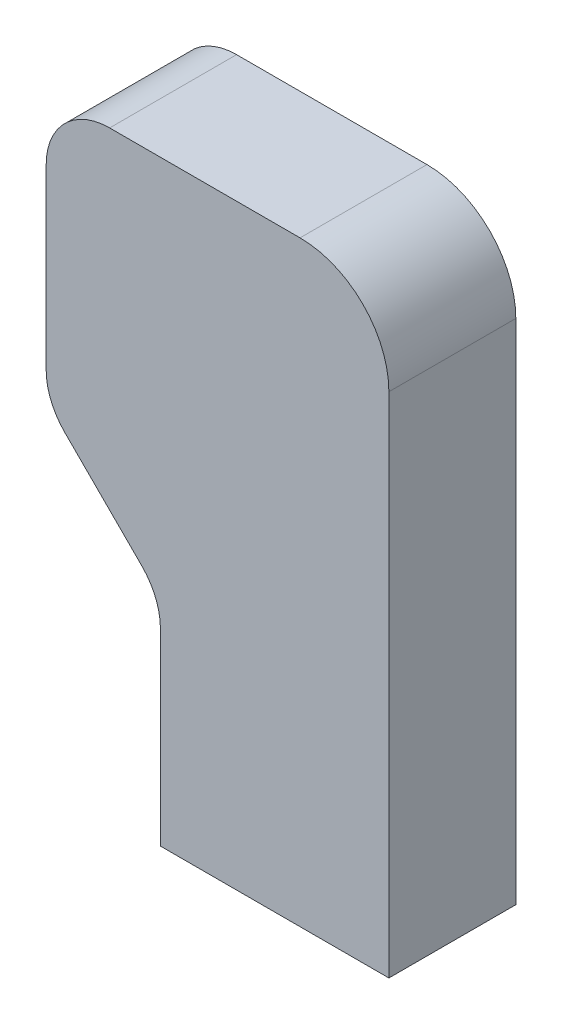
ISO-10303-21;
HEADER;
FILE_DESCRIPTION(('STEP AP214'),'2;1');
FILE_NAME('part.step','',(''),(''),'','','');
FILE_SCHEMA(('AUTOMOTIVE_DESIGN { 1 0 10303 214 1 1 1 1 }'));
ENDSEC;
DATA;
#1=APPLICATION_CONTEXT('core data for automotive mechanical design processes');
#2=APPLICATION_PROTOCOL_DEFINITION('international standard','automotive_design',2000,#1);
#3=PRODUCT_CONTEXT('',#1,'mechanical');
#4=PRODUCT('Part','Part','',(#3));
#5=PRODUCT_RELATED_PRODUCT_CATEGORY('part','',(#4));
#6=PRODUCT_DEFINITION_FORMATION('','',#4);
#7=PRODUCT_DEFINITION_CONTEXT('part definition',#1,'design');
#8=PRODUCT_DEFINITION('design','',#6,#7);
#9=PRODUCT_DEFINITION_SHAPE('','',#8);
#10=(LENGTH_UNIT() NAMED_UNIT(*) SI_UNIT(.MILLI.,.METRE.));
#11=(NAMED_UNIT(*) PLANE_ANGLE_UNIT() SI_UNIT($,.RADIAN.));
#12=(NAMED_UNIT(*) SI_UNIT($,.STERADIAN.) SOLID_ANGLE_UNIT());
#13=UNCERTAINTY_MEASURE_WITH_UNIT(LENGTH_MEASURE(1.E-05),#10,'distance_accuracy_value','');
#14=(GEOMETRIC_REPRESENTATION_CONTEXT(3) GLOBAL_UNCERTAINTY_ASSIGNED_CONTEXT((#13)) GLOBAL_UNIT_ASSIGNED_CONTEXT((#10,
#11,#12)) REPRESENTATION_CONTEXT('',''));
#15=CARTESIAN_POINT('',(0.,0.,0.));
#16=DIRECTION('',(0.,0.,1.));
#17=DIRECTION('',(1.,0.,0.));
#18=AXIS2_PLACEMENT_3D('',#15,#16,#17);
#19=CARTESIAN_POINT('',(148.398415157062,142.126869168105,0.38));
#20=DIRECTION('',(0.,0.,1.));
#21=DIRECTION('',(1.,0.,0.));
#22=AXIS2_PLACEMENT_3D('',#19,#20,#21);
#23=CYLINDRICAL_SURFACE('',#22,0.635000000000015);
#24=DIRECTION('',(0.,0.,1.));
#25=VECTOR('',#24,1.);
#26=CARTESIAN_POINT('',(149.033415157062,142.126869168105,-0.38));
#27=LINE('',#26,#25);
#28=CARTESIAN_POINT('',(149.033415157062,142.126869168105,0.38));
#29=VERTEX_POINT('',#28);
#30=CARTESIAN_POINT('',(149.033415157062,142.126869168105,-0.38));
#31=VERTEX_POINT('',#30);
#32=EDGE_CURVE('E147',#29,#31,#27,.F.);
#33=ORIENTED_EDGE('',*,*,#32,.F.);
#34=CARTESIAN_POINT('',(148.398415157062,142.126869168105,0.38));
#35=DIRECTION('',(0.,0.,1.));
#36=DIRECTION('',(1.,0.,0.));
#37=AXIS2_PLACEMENT_3D('',#34,#35,#36);
#38=CIRCLE('',#37,0.635000000000015);
#39=CARTESIAN_POINT('',(147.763415157062,142.126869168105,0.38));
#40=VERTEX_POINT('',#39);
#41=EDGE_CURVE('E50',#40,#29,#38,.F.);
#42=ORIENTED_EDGE('',*,*,#41,.F.);
#43=DIRECTION('',(0.,0.,1.));
#44=VECTOR('',#43,1.);
#45=CARTESIAN_POINT('',(147.763415157062,142.126869168105,0.38));
#46=LINE('',#45,#44);
#47=CARTESIAN_POINT('',(147.763415157062,142.126869168105,-0.38));
#48=VERTEX_POINT('',#47);
#49=EDGE_CURVE('E283',#48,#40,#46,.T.);
#50=ORIENTED_EDGE('',*,*,#49,.F.);
#51=CARTESIAN_POINT('',(148.398415157062,142.126869168105,-0.38));
#52=DIRECTION('',(0.,0.,-1.));
#53=DIRECTION('',(-1.,0.,0.));
#54=AXIS2_PLACEMENT_3D('',#51,#52,#53);
#55=CIRCLE('',#54,0.635000000000015);
#56=EDGE_CURVE('E11',#31,#48,#55,.F.);
#57=ORIENTED_EDGE('',*,*,#56,.F.);
#58=EDGE_LOOP('',(#33,#42,#50,#57));
#59=FACE_BOUND('',#58,.T.);
#60=ADVANCED_FACE('F41',(#59),#23,.F.);
#61=CARTESIAN_POINT('',(149.541415157062,138.021869168105,0.635));
#62=DIRECTION('',(-1.,0.,0.));
#63=DIRECTION('',(0.,0.,1.));
#64=AXIS2_PLACEMENT_3D('',#61,#62,#63);
#65=PLANE('',#64);
#66=DIRECTION('',(0.,1.,0.));
#67=VECTOR('',#66,1.);
#68=CARTESIAN_POINT('',(149.541415157062,138.021869168105,-0.635));
#69=LINE('',#68,#67);
#70=CARTESIAN_POINT('',(149.541415157062,138.021869168105,-0.635));
#71=VERTEX_POINT('',#70);
#72=CARTESIAN_POINT('',(149.541415157062,143.101869168105,-0.635));
#73=VERTEX_POINT('',#72);
#74=EDGE_CURVE('E175',#71,#73,#69,.T.);
#75=ORIENTED_EDGE('',*,*,#74,.T.);
#76=DIRECTION('',(0.,0.,-1.));
#77=VECTOR('',#76,1.);
#78=CARTESIAN_POINT('',(149.541415157062,143.101869168105,0.635));
#79=LINE('',#78,#77);
#80=CARTESIAN_POINT('',(149.541415157062,143.101869168105,0.635));
#81=VERTEX_POINT('',#80);
#82=EDGE_CURVE('E277',#81,#73,#79,.T.);
#83=ORIENTED_EDGE('',*,*,#82,.F.);
#84=DIRECTION('',(0.,1.,0.));
#85=VECTOR('',#84,1.);
#86=CARTESIAN_POINT('',(149.541415157062,138.021869168105,0.635));
#87=LINE('',#86,#85);
#88=CARTESIAN_POINT('',(149.541415157062,138.021869168105,0.635));
#89=VERTEX_POINT('',#88);
#90=EDGE_CURVE('E180',#89,#81,#87,.T.);
#91=ORIENTED_EDGE('',*,*,#90,.F.);
#92=DIRECTION('',(0.,0.,-1.));
#93=VECTOR('',#92,1.);
#94=CARTESIAN_POINT('',(149.541415157062,138.021869168105,0.635));
#95=LINE('',#94,#93);
#96=EDGE_CURVE('E212',#89,#71,#95,.T.);
#97=ORIENTED_EDGE('',*,*,#96,.T.);
#98=EDGE_LOOP('',(#75,#83,#91,#97));
#99=FACE_BOUND('',#98,.T.);
#100=ADVANCED_FACE('F306',(#99),#65,.F.);
#101=CARTESIAN_POINT('',(148.652415157062,143.101869168084,0.635));
#102=DIRECTION('',(0.,0.,-1.));
#103=DIRECTION('',(-1.,0.,0.));
#104=AXIS2_PLACEMENT_3D('',#101,#102,#103);
#105=CYLINDRICAL_SURFACE('',#104,0.888999999999987);
#106=CARTESIAN_POINT('',(148.652415157062,143.101869168084,-0.635));
#107=DIRECTION('',(0.,0.,1.));
#108=DIRECTION('',(1.,0.,0.));
#109=AXIS2_PLACEMENT_3D('',#106,#107,#108);
#110=CIRCLE('',#109,0.888999999999987);
#111=CARTESIAN_POINT('',(148.652415157183,143.990869168084,-0.635));
#112=VERTEX_POINT('',#111);
#113=EDGE_CURVE('E216',#73,#112,#110,.T.);
#114=ORIENTED_EDGE('',*,*,#113,.T.);
#115=DIRECTION('',(0.,0.,-1.));
#116=VECTOR('',#115,1.);
#117=CARTESIAN_POINT('',(148.652415157183,143.990869168084,0.635));
#118=LINE('',#117,#116);
#119=CARTESIAN_POINT('',(148.652415157183,143.990869168084,0.635));
#120=VERTEX_POINT('',#119);
#121=EDGE_CURVE('E273',#120,#112,#118,.T.);
#122=ORIENTED_EDGE('',*,*,#121,.F.);
#123=CARTESIAN_POINT('',(148.652415157062,143.101869168084,0.635));
#124=DIRECTION('',(0.,0.,1.));
#125=DIRECTION('',(1.,0.,0.));
#126=AXIS2_PLACEMENT_3D('',#123,#124,#125);
#127=CIRCLE('',#126,0.888999999999987);
#128=EDGE_CURVE('E184',#81,#120,#127,.T.);
#129=ORIENTED_EDGE('',*,*,#128,.F.);
#130=ORIENTED_EDGE('',*,*,#82,.T.);
#131=EDGE_LOOP('',(#114,#122,#129,#130));
#132=FACE_BOUND('',#131,.T.);
#133=ADVANCED_FACE('F310',(#132),#105,.T.);
#134=CARTESIAN_POINT('',(148.652415157183,143.990869168084,0.635));
#135=DIRECTION('',(0.,-1.,0.));
#136=DIRECTION('',(1.,0.,0.));
#137=AXIS2_PLACEMENT_3D('',#134,#135,#136);
#138=PLANE('',#137);
#139=DIRECTION('',(-1.,0.,0.));
#140=VECTOR('',#139,1.);
#141=CARTESIAN_POINT('',(148.652415157183,143.990869168084,-0.635));
#142=LINE('',#141,#140);
#143=CARTESIAN_POINT('',(146.747415157183,143.990869168084,-0.635));
#144=VERTEX_POINT('',#143);
#145=EDGE_CURVE('E219',#112,#144,#142,.T.);
#146=ORIENTED_EDGE('',*,*,#145,.T.);
#147=DIRECTION('',(0.,0.,-1.));
#148=VECTOR('',#147,1.);
#149=CARTESIAN_POINT('',(146.747415157183,143.990869168084,0.635));
#150=LINE('',#149,#148);
#151=CARTESIAN_POINT('',(146.747415157183,143.990869168084,0.635));
#152=VERTEX_POINT('',#151);
#153=EDGE_CURVE('E269',#152,#144,#150,.T.);
#154=ORIENTED_EDGE('',*,*,#153,.F.);
#155=DIRECTION('',(-1.,0.,0.));
#156=VECTOR('',#155,1.);
#157=CARTESIAN_POINT('',(148.652415157183,143.990869168084,0.635));
#158=LINE('',#157,#156);
#159=EDGE_CURVE('E188',#120,#152,#158,.T.);
#160=ORIENTED_EDGE('',*,*,#159,.F.);
#161=ORIENTED_EDGE('',*,*,#121,.T.);
#162=EDGE_LOOP('',(#146,#154,#160,#161));
#163=FACE_BOUND('',#162,.T.);
#164=ADVANCED_FACE('F315',(#163),#138,.F.);
#165=CARTESIAN_POINT('',(146.747415157133,143.355869168084,0.635));
#166=DIRECTION('',(0.,0.,-1.));
#167=DIRECTION('',(-1.,0.,0.));
#168=AXIS2_PLACEMENT_3D('',#165,#166,#167);
#169=CYLINDRICAL_SURFACE('',#168,0.634999999999969);
#170=CARTESIAN_POINT('',(146.747415157133,143.355869168084,-0.635));
#171=DIRECTION('',(0.,0.,1.));
#172=DIRECTION('',(1.,0.,0.));
#173=AXIS2_PLACEMENT_3D('',#170,#171,#172);
#174=CIRCLE('',#173,0.634999999999969);
#175=CARTESIAN_POINT('',(146.112415157133,143.355869168134,-0.635));
#176=VERTEX_POINT('',#175);
#177=EDGE_CURVE('E222',#144,#176,#174,.T.);
#178=ORIENTED_EDGE('',*,*,#177,.T.);
#179=DIRECTION('',(0.,0.,-1.));
#180=VECTOR('',#179,1.);
#181=CARTESIAN_POINT('',(146.112415157133,143.355869168134,0.635));
#182=LINE('',#181,#180);
#183=CARTESIAN_POINT('',(146.112415157133,143.355869168134,0.635));
#184=VERTEX_POINT('',#183);
#185=EDGE_CURVE('E265',#184,#176,#182,.T.);
#186=ORIENTED_EDGE('',*,*,#185,.F.);
#187=CARTESIAN_POINT('',(146.747415157133,143.355869168084,0.635));
#188=DIRECTION('',(0.,0.,1.));
#189=DIRECTION('',(1.,0.,0.));
#190=AXIS2_PLACEMENT_3D('',#187,#188,#189);
#191=CIRCLE('',#190,0.634999999999969);
#192=EDGE_CURVE('E191',#152,#184,#191,.T.);
#193=ORIENTED_EDGE('',*,*,#192,.F.);
#194=ORIENTED_EDGE('',*,*,#153,.T.);
#195=EDGE_LOOP('',(#178,#186,#193,#194));
#196=FACE_BOUND('',#195,.T.);
#197=ADVANCED_FACE('F321',(#196),#169,.T.);
#198=CARTESIAN_POINT('',(146.112415157133,143.355869168134,0.635));
#199=DIRECTION('',(1.,0.,0.));
#200=DIRECTION('',(0.,1.,0.));
#201=AXIS2_PLACEMENT_3D('',#198,#199,#200);
#202=PLANE('',#201);
#203=DIRECTION('',(0.,-1.,0.));
#204=VECTOR('',#203,1.);
#205=CARTESIAN_POINT('',(146.112415157133,143.355869168134,-0.635));
#206=LINE('',#205,#204);
#207=CARTESIAN_POINT('',(146.112415157133,141.576871307021,-0.635));
#208=VERTEX_POINT('',#207);
#209=EDGE_CURVE('E225',#176,#208,#206,.T.);
#210=ORIENTED_EDGE('',*,*,#209,.T.);
#211=DIRECTION('',(0.,0.,-1.));
#212=VECTOR('',#211,1.);
#213=CARTESIAN_POINT('',(146.112415157133,141.576871307021,0.635));
#214=LINE('',#213,#212);
#215=CARTESIAN_POINT('',(146.112415157133,141.576871307021,0.635));
#216=VERTEX_POINT('',#215);
#217=EDGE_CURVE('E261',#216,#208,#214,.T.);
#218=ORIENTED_EDGE('',*,*,#217,.F.);
#219=DIRECTION('',(0.,-1.,0.));
#220=VECTOR('',#219,1.);
#221=CARTESIAN_POINT('',(146.112415157133,143.355869168134,0.635));
#222=LINE('',#221,#220);
#223=EDGE_CURVE('E194',#184,#216,#222,.T.);
#224=ORIENTED_EDGE('',*,*,#223,.F.);
#225=ORIENTED_EDGE('',*,*,#185,.T.);
#226=EDGE_LOOP('',(#210,#218,#224,#225));
#227=FACE_BOUND('',#226,.T.);
#228=ADVANCED_FACE('F325',(#227),#202,.F.);
#229=CARTESIAN_POINT('',(146.747415157133,141.576871306971,0.635));
#230=DIRECTION('',(0.,0.,-1.));
#231=DIRECTION('',(-1.,0.,0.));
#232=AXIS2_PLACEMENT_3D('',#229,#230,#231);
#233=CYLINDRICAL_SURFACE('',#232,0.635000000000029);
#234=CARTESIAN_POINT('',(146.747415157133,141.576871306971,-0.635));
#235=DIRECTION('',(0.,0.,1.));
#236=DIRECTION('',(1.,0.,0.));
#237=AXIS2_PLACEMENT_3D('',#234,#235,#236);
#238=CIRCLE('',#237,0.635000000000029);
#239=CARTESIAN_POINT('',(146.298402351044,141.127858500953,-0.635));
#240=VERTEX_POINT('',#239);
#241=EDGE_CURVE('E228',#208,#240,#238,.T.);
#242=ORIENTED_EDGE('',*,*,#241,.T.);
#243=DIRECTION('',(0.,0.,-1.));
#244=VECTOR('',#243,1.);
#245=CARTESIAN_POINT('',(146.298402351044,141.127858500953,0.635));
#246=LINE('',#245,#244);
#247=CARTESIAN_POINT('',(146.298402351044,141.127858500953,0.635));
#248=VERTEX_POINT('',#247);
#249=EDGE_CURVE('E257',#248,#240,#246,.T.);
#250=ORIENTED_EDGE('',*,*,#249,.F.);
#251=CARTESIAN_POINT('',(146.747415157133,141.576871306971,0.635));
#252=DIRECTION('',(0.,0.,1.));
#253=DIRECTION('',(1.,0.,0.));
#254=AXIS2_PLACEMENT_3D('',#251,#252,#253);
#255=CIRCLE('',#254,0.635000000000029);
#256=EDGE_CURVE('E197',#216,#248,#255,.T.);
#257=ORIENTED_EDGE('',*,*,#256,.F.);
#258=ORIENTED_EDGE('',*,*,#217,.T.);
#259=EDGE_LOOP('',(#242,#250,#257,#258));
#260=FACE_BOUND('',#259,.T.);
#261=ADVANCED_FACE('F329',(#260),#233,.T.);
#262=CARTESIAN_POINT('',(146.298402351044,141.127858500953,0.635));
#263=DIRECTION('',(0.707106781186611,0.707106781186484,0.));
#264=DIRECTION('',(-0.707106781186484,0.707106781186611,0.));
#265=AXIS2_PLACEMENT_3D('',#262,#263,#264);
#266=PLANE('',#265);
#267=DIRECTION('',(0.707106781186484,-0.707106781186611,0.));
#268=VECTOR('',#267,1.);
#269=CARTESIAN_POINT('',(146.298402351044,141.127858500953,-0.635));
#270=LINE('',#269,#268);
#271=CARTESIAN_POINT('',(147.069427963151,140.356832888846,-0.635));
#272=VERTEX_POINT('',#271);
#273=EDGE_CURVE('E231',#240,#272,#270,.T.);
#274=ORIENTED_EDGE('',*,*,#273,.T.);
#275=DIRECTION('',(0.,0.,-1.));
#276=VECTOR('',#275,1.);
#277=CARTESIAN_POINT('',(147.069427963151,140.356832888846,0.635));
#278=LINE('',#277,#276);
#279=CARTESIAN_POINT('',(147.069427963151,140.356832888846,0.635));
#280=VERTEX_POINT('',#279);
#281=EDGE_CURVE('E253',#280,#272,#278,.T.);
#282=ORIENTED_EDGE('',*,*,#281,.F.);
#283=DIRECTION('',(0.707106781186484,-0.707106781186611,0.));
#284=VECTOR('',#283,1.);
#285=CARTESIAN_POINT('',(146.298402351044,141.127858500953,0.635));
#286=LINE('',#285,#284);
#287=EDGE_CURVE('E200',#248,#280,#286,.T.);
#288=ORIENTED_EDGE('',*,*,#287,.F.);
#289=ORIENTED_EDGE('',*,*,#249,.T.);
#290=EDGE_LOOP('',(#274,#282,#288,#289));
#291=FACE_BOUND('',#290,.T.);
#292=ADVANCED_FACE('F333',(#291),#266,.F.);
#293=CARTESIAN_POINT('',(146.620415157062,139.907820082828,0.635));
#294=DIRECTION('',(0.,0.,-1.));
#295=DIRECTION('',(-1.,0.,0.));
#296=AXIS2_PLACEMENT_3D('',#293,#294,#295);
#297=CYLINDRICAL_SURFACE('',#296,0.634999999999942);
#298=CARTESIAN_POINT('',(146.620415157062,139.907820082828,-0.635));
#299=DIRECTION('',(0.,0.,-1.));
#300=DIRECTION('',(1.,0.,0.));
#301=AXIS2_PLACEMENT_3D('',#298,#299,#300);
#302=CIRCLE('',#301,0.634999999999942);
#303=CARTESIAN_POINT('',(147.255415157062,139.907820082778,-0.635));
#304=VERTEX_POINT('',#303);
#305=EDGE_CURVE('E234',#272,#304,#302,.T.);
#306=ORIENTED_EDGE('',*,*,#305,.T.);
#307=DIRECTION('',(0.,0.,-1.));
#308=VECTOR('',#307,1.);
#309=CARTESIAN_POINT('',(147.255415157062,139.907820082778,0.635));
#310=LINE('',#309,#308);
#311=CARTESIAN_POINT('',(147.255415157062,139.907820082778,0.635));
#312=VERTEX_POINT('',#311);
#313=EDGE_CURVE('E249',#312,#304,#310,.T.);
#314=ORIENTED_EDGE('',*,*,#313,.F.);
#315=CARTESIAN_POINT('',(146.620415157062,139.907820082828,0.635));
#316=DIRECTION('',(0.,0.,-1.));
#317=DIRECTION('',(1.,0.,0.));
#318=AXIS2_PLACEMENT_3D('',#315,#316,#317);
#319=CIRCLE('',#318,0.634999999999942);
#320=EDGE_CURVE('E203',#280,#312,#319,.T.);
#321=ORIENTED_EDGE('',*,*,#320,.F.);
#322=ORIENTED_EDGE('',*,*,#281,.T.);
#323=EDGE_LOOP('',(#306,#314,#321,#322));
#324=FACE_BOUND('',#323,.T.);
#325=ADVANCED_FACE('F337',(#324),#297,.F.);
#326=CARTESIAN_POINT('',(147.255415157062,139.907820082778,0.635));
#327=DIRECTION('',(1.,0.,0.));
#328=DIRECTION('',(0.,0.,-1.));
#329=AXIS2_PLACEMENT_3D('',#326,#327,#328);
#330=PLANE('',#329);
#331=DIRECTION('',(0.,-1.,0.));
#332=VECTOR('',#331,1.);
#333=CARTESIAN_POINT('',(147.255415157062,139.907820082778,-0.635));
#334=LINE('',#333,#332);
#335=CARTESIAN_POINT('',(147.255415157062,138.021869168105,-0.635));
#336=VERTEX_POINT('',#335);
#337=EDGE_CURVE('E237',#304,#336,#334,.T.);
#338=ORIENTED_EDGE('',*,*,#337,.T.);
#339=DIRECTION('',(0.,0.,-1.));
#340=VECTOR('',#339,1.);
#341=CARTESIAN_POINT('',(147.255415157062,138.021869168105,0.635));
#342=LINE('',#341,#340);
#343=CARTESIAN_POINT('',(147.255415157062,138.021869168105,0.635));
#344=VERTEX_POINT('',#343);
#345=EDGE_CURVE('E245',#344,#336,#342,.T.);
#346=ORIENTED_EDGE('',*,*,#345,.F.);
#347=DIRECTION('',(0.,-1.,0.));
#348=VECTOR('',#347,1.);
#349=CARTESIAN_POINT('',(147.255415157062,139.907820082778,0.635));
#350=LINE('',#349,#348);
#351=EDGE_CURVE('E206',#312,#344,#350,.T.);
#352=ORIENTED_EDGE('',*,*,#351,.F.);
#353=ORIENTED_EDGE('',*,*,#313,.T.);
#354=EDGE_LOOP('',(#338,#346,#352,#353));
#355=FACE_BOUND('',#354,.T.);
#356=ADVANCED_FACE('F341',(#355),#330,.F.);
#357=CARTESIAN_POINT('',(147.255415157062,138.021869168105,0.635));
#358=DIRECTION('',(0.,1.,0.));
#359=DIRECTION('',(0.,0.,1.));
#360=AXIS2_PLACEMENT_3D('',#357,#358,#359);
#361=PLANE('',#360);
#362=DIRECTION('',(1.,0.,0.));
#363=VECTOR('',#362,1.);
#364=CARTESIAN_POINT('',(147.763415157062,138.021869168105,-0.38));
#365=LINE('',#364,#363);
#366=CARTESIAN_POINT('',(147.763415157062,138.021869168105,-0.38));
#367=VERTEX_POINT('',#366);
#368=CARTESIAN_POINT('',(149.033415157062,138.021869168105,-0.38));
#369=VERTEX_POINT('',#368);
#370=EDGE_CURVE('E153',#367,#369,#365,.T.);
#371=ORIENTED_EDGE('',*,*,#370,.F.);
#372=DIRECTION('',(0.,0.,-1.));
#373=VECTOR('',#372,1.);
#374=CARTESIAN_POINT('',(147.763415157062,138.021869168105,0.38));
#375=LINE('',#374,#373);
#376=CARTESIAN_POINT('',(147.763415157062,138.021869168105,0.38));
#377=VERTEX_POINT('',#376);
#378=EDGE_CURVE('E160',#377,#367,#375,.T.);
#379=ORIENTED_EDGE('',*,*,#378,.F.);
#380=DIRECTION('',(-1.,0.,0.));
#381=VECTOR('',#380,1.);
#382=CARTESIAN_POINT('',(149.033415157062,138.021869168105,0.38));
#383=LINE('',#382,#381);
#384=CARTESIAN_POINT('',(149.033415157062,138.021869168105,0.38));
#385=VERTEX_POINT('',#384);
#386=EDGE_CURVE('E165',#385,#377,#383,.T.);
#387=ORIENTED_EDGE('',*,*,#386,.F.);
#388=DIRECTION('',(0.,0.,1.));
#389=VECTOR('',#388,1.);
#390=CARTESIAN_POINT('',(149.033415157062,138.021869168105,-0.38));
#391=LINE('',#390,#389);
#392=EDGE_CURVE('E145',#369,#385,#391,.T.);
#393=ORIENTED_EDGE('',*,*,#392,.F.);
#394=EDGE_LOOP('',(#371,#379,#387,#393));
#395=FACE_BOUND('',#394,.T.);
#396=DIRECTION('',(1.,0.,0.));
#397=VECTOR('',#396,1.);
#398=CARTESIAN_POINT('',(147.255415157062,138.021869168105,-0.635));
#399=LINE('',#398,#397);
#400=EDGE_CURVE('E185',#336,#71,#399,.T.);
#401=ORIENTED_EDGE('',*,*,#400,.T.);
#402=ORIENTED_EDGE('',*,*,#96,.F.);
#403=DIRECTION('',(1.,0.,0.));
#404=VECTOR('',#403,1.);
#405=CARTESIAN_POINT('',(147.255415157062,138.021869168105,0.635));
#406=LINE('',#405,#404);
#407=EDGE_CURVE('E209',#344,#89,#406,.T.);
#408=ORIENTED_EDGE('',*,*,#407,.F.);
#409=ORIENTED_EDGE('',*,*,#345,.T.);
#410=EDGE_LOOP('',(#401,#402,#408,#409));
#411=FACE_BOUND('',#410,.T.);
#412=ADVANCED_FACE('F162',(#395,#411),#361,.F.);
#413=CARTESIAN_POINT('',(148.652415157062,143.101869168084,0.635));
#414=DIRECTION('',(0.,0.,1.));
#415=DIRECTION('',(1.,0.,0.));
#416=AXIS2_PLACEMENT_3D('',#413,#414,#415);
#417=PLANE('',#416);
#418=ORIENTED_EDGE('',*,*,#90,.T.);
#419=ORIENTED_EDGE('',*,*,#128,.T.);
#420=ORIENTED_EDGE('',*,*,#159,.T.);
#421=ORIENTED_EDGE('',*,*,#192,.T.);
#422=ORIENTED_EDGE('',*,*,#223,.T.);
#423=ORIENTED_EDGE('',*,*,#256,.T.);
#424=ORIENTED_EDGE('',*,*,#287,.T.);
#425=ORIENTED_EDGE('',*,*,#320,.T.);
#426=ORIENTED_EDGE('',*,*,#351,.T.);
#427=ORIENTED_EDGE('',*,*,#407,.T.);
#428=EDGE_LOOP('',(#418,#419,#420,#421,#422,#423,#424,#425,#426,#427));
#429=FACE_BOUND('',#428,.T.);
#430=ADVANCED_FACE('F300',(#429),#417,.T.);
#431=CARTESIAN_POINT('',(148.652415157062,143.101869168084,-0.635));
#432=DIRECTION('',(0.,0.,1.));
#433=DIRECTION('',(1.,0.,0.));
#434=AXIS2_PLACEMENT_3D('',#431,#432,#433);
#435=PLANE('',#434);
#436=ORIENTED_EDGE('',*,*,#74,.F.);
#437=ORIENTED_EDGE('',*,*,#400,.F.);
#438=ORIENTED_EDGE('',*,*,#337,.F.);
#439=ORIENTED_EDGE('',*,*,#305,.F.);
#440=ORIENTED_EDGE('',*,*,#273,.F.);
#441=ORIENTED_EDGE('',*,*,#241,.F.);
#442=ORIENTED_EDGE('',*,*,#209,.F.);
#443=ORIENTED_EDGE('',*,*,#177,.F.);
#444=ORIENTED_EDGE('',*,*,#145,.F.);
#445=ORIENTED_EDGE('',*,*,#113,.F.);
#446=EDGE_LOOP('',(#436,#437,#438,#439,#440,#441,#442,#443,#444,#445));
#447=FACE_BOUND('',#446,.T.);
#448=ADVANCED_FACE('F293',(#447),#435,.F.);
#449=CARTESIAN_POINT('',(147.763415157062,142.761869168105,0.38));
#450=DIRECTION('',(-1.,0.,0.));
#451=DIRECTION('',(0.,0.,1.));
#452=AXIS2_PLACEMENT_3D('',#449,#450,#451);
#453=PLANE('',#452);
#454=DIRECTION('',(0.,-1.,0.));
#455=VECTOR('',#454,1.);
#456=CARTESIAN_POINT('',(147.763415157062,142.761869168105,-0.38));
#457=LINE('',#456,#455);
#458=EDGE_CURVE('E150',#48,#367,#457,.T.);
#459=ORIENTED_EDGE('',*,*,#458,.F.);
#460=ORIENTED_EDGE('',*,*,#49,.T.);
#461=DIRECTION('',(0.,-1.,0.));
#462=VECTOR('',#461,1.);
#463=CARTESIAN_POINT('',(147.763415157062,142.761869168105,0.38));
#464=LINE('',#463,#462);
#465=EDGE_CURVE('E172',#40,#377,#464,.T.);
#466=ORIENTED_EDGE('',*,*,#465,.T.);
#467=ORIENTED_EDGE('',*,*,#378,.T.);
#468=EDGE_LOOP('',(#459,#460,#466,#467));
#469=FACE_BOUND('',#468,.T.);
#470=ADVANCED_FACE('F290',(#469),#453,.F.);
#471=CARTESIAN_POINT('',(149.033415157062,142.761869168105,0.38));
#472=DIRECTION('',(0.,0.,1.));
#473=DIRECTION('',(1.,0.,0.));
#474=AXIS2_PLACEMENT_3D('',#471,#472,#473);
#475=PLANE('',#474);
#476=ORIENTED_EDGE('',*,*,#465,.F.);
#477=ORIENTED_EDGE('',*,*,#41,.T.);
#478=DIRECTION('',(0.,-1.,0.));
#479=VECTOR('',#478,1.);
#480=CARTESIAN_POINT('',(149.033415157062,142.761869168105,0.38));
#481=LINE('',#480,#479);
#482=EDGE_CURVE('E149',#29,#385,#481,.T.);
#483=ORIENTED_EDGE('',*,*,#482,.T.);
#484=ORIENTED_EDGE('',*,*,#386,.T.);
#485=EDGE_LOOP('',(#476,#477,#483,#484));
#486=FACE_BOUND('',#485,.T.);
#487=ADVANCED_FACE('F288',(#486),#475,.F.);
#488=CARTESIAN_POINT('',(149.033415157062,142.761869168105,-0.38));
#489=DIRECTION('',(1.,0.,0.));
#490=DIRECTION('',(0.,0.,-1.));
#491=AXIS2_PLACEMENT_3D('',#488,#489,#490);
#492=PLANE('',#491);
#493=ORIENTED_EDGE('',*,*,#482,.F.);
#494=ORIENTED_EDGE('',*,*,#32,.T.);
#495=DIRECTION('',(0.,-1.,0.));
#496=VECTOR('',#495,1.);
#497=CARTESIAN_POINT('',(149.033415157062,142.761869168105,-0.38));
#498=LINE('',#497,#496);
#499=EDGE_CURVE('E140',#31,#369,#498,.T.);
#500=ORIENTED_EDGE('',*,*,#499,.T.);
#501=ORIENTED_EDGE('',*,*,#392,.T.);
#502=EDGE_LOOP('',(#493,#494,#500,#501));
#503=FACE_BOUND('',#502,.T.);
#504=ADVANCED_FACE('F143',(#503),#492,.F.);
#505=CARTESIAN_POINT('',(147.763415157062,142.761869168105,-0.38));
#506=DIRECTION('',(0.,0.,-1.));
#507=DIRECTION('',(-1.,0.,0.));
#508=AXIS2_PLACEMENT_3D('',#505,#506,#507);
#509=PLANE('',#508);
#510=ORIENTED_EDGE('',*,*,#499,.F.);
#511=ORIENTED_EDGE('',*,*,#56,.T.);
#512=ORIENTED_EDGE('',*,*,#458,.T.);
#513=ORIENTED_EDGE('',*,*,#370,.T.);
#514=EDGE_LOOP('',(#510,#511,#512,#513));
#515=FACE_BOUND('',#514,.T.);
#516=ADVANCED_FACE('F154',(#515),#509,.F.);
#517=CLOSED_SHELL('',(#60,#100,#133,#164,#197,#228,#261,#292,#325,#356,#412,#430,#448,#470,#487,
#504,#516));
#518=MANIFOLD_SOLID_BREP('B2',#517);
#519=ADVANCED_BREP_SHAPE_REPRESENTATION('',(#18,#518),#14);
#520=SHAPE_DEFINITION_REPRESENTATION(#9,#519);
ENDSEC;
END-ISO-10303-21;
